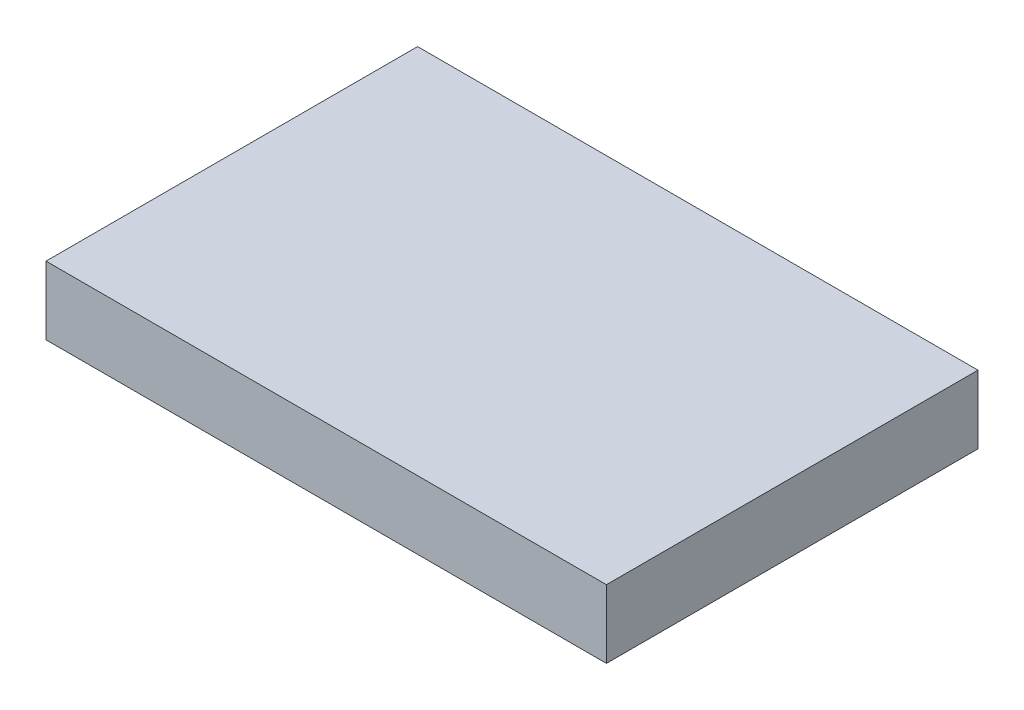
ISO-10303-21;
HEADER;
FILE_DESCRIPTION(('STEP AP214'),'2;1');
FILE_NAME('part.step','',(''),(''),'','','');
FILE_SCHEMA(('AUTOMOTIVE_DESIGN { 1 0 10303 214 1 1 1 1 }'));
ENDSEC;
DATA;
#1=APPLICATION_CONTEXT('core data for automotive mechanical design processes');
#2=APPLICATION_PROTOCOL_DEFINITION('international standard','automotive_design',2000,#1);
#3=PRODUCT_CONTEXT('',#1,'mechanical');
#4=PRODUCT('Part','Part','',(#3));
#5=PRODUCT_RELATED_PRODUCT_CATEGORY('part','',(#4));
#6=PRODUCT_DEFINITION_FORMATION('','',#4);
#7=PRODUCT_DEFINITION_CONTEXT('part definition',#1,'design');
#8=PRODUCT_DEFINITION('design','',#6,#7);
#9=PRODUCT_DEFINITION_SHAPE('','',#8);
#10=(LENGTH_UNIT() NAMED_UNIT(*) SI_UNIT(.MILLI.,.METRE.));
#11=(NAMED_UNIT(*) PLANE_ANGLE_UNIT() SI_UNIT($,.RADIAN.));
#12=(NAMED_UNIT(*) SI_UNIT($,.STERADIAN.) SOLID_ANGLE_UNIT());
#13=UNCERTAINTY_MEASURE_WITH_UNIT(LENGTH_MEASURE(1.E-05),#10,'distance_accuracy_value','');
#14=(GEOMETRIC_REPRESENTATION_CONTEXT(3) GLOBAL_UNCERTAINTY_ASSIGNED_CONTEXT((#13)) GLOBAL_UNIT_ASSIGNED_CONTEXT((#10,
#11,#12)) REPRESENTATION_CONTEXT('',''));
#15=CARTESIAN_POINT('',(0.,0.,0.));
#16=DIRECTION('',(0.,0.,1.));
#17=DIRECTION('',(1.,0.,0.));
#18=AXIS2_PLACEMENT_3D('',#15,#16,#17);
#19=CARTESIAN_POINT('',(-41.1,10.,-27.25));
#20=DIRECTION('',(1.,0.,0.));
#21=DIRECTION('',(0.,0.,-1.));
#22=AXIS2_PLACEMENT_3D('',#19,#20,#21);
#23=PLANE('',#22);
#24=DIRECTION('',(0.,0.,1.));
#25=VECTOR('',#24,1.);
#26=CARTESIAN_POINT('',(-41.1,0.,-27.25));
#27=LINE('',#26,#25);
#28=CARTESIAN_POINT('',(-41.1,0.,-27.25));
#29=VERTEX_POINT('',#28);
#30=CARTESIAN_POINT('',(-41.1,0.,27.25));
#31=VERTEX_POINT('',#30);
#32=EDGE_CURVE('E107',#29,#31,#27,.T.);
#33=ORIENTED_EDGE('',*,*,#32,.T.);
#34=DIRECTION('',(0.,-1.,0.));
#35=VECTOR('',#34,1.);
#36=CARTESIAN_POINT('',(-41.1,10.,27.25));
#37=LINE('',#36,#35);
#38=CARTESIAN_POINT('',(-41.1,10.,27.25));
#39=VERTEX_POINT('',#38);
#40=EDGE_CURVE('E11',#39,#31,#37,.T.);
#41=ORIENTED_EDGE('',*,*,#40,.F.);
#42=DIRECTION('',(0.,0.,1.));
#43=VECTOR('',#42,1.);
#44=CARTESIAN_POINT('',(-41.1,10.,-27.25));
#45=LINE('',#44,#43);
#46=CARTESIAN_POINT('',(-41.1,10.,-27.25));
#47=VERTEX_POINT('',#46);
#48=EDGE_CURVE('E91',#47,#39,#45,.T.);
#49=ORIENTED_EDGE('',*,*,#48,.F.);
#50=DIRECTION('',(0.,-1.,0.));
#51=VECTOR('',#50,1.);
#52=CARTESIAN_POINT('',(-41.1,10.,-27.25));
#53=LINE('',#52,#51);
#54=EDGE_CURVE('E103',#47,#29,#53,.T.);
#55=ORIENTED_EDGE('',*,*,#54,.T.);
#56=EDGE_LOOP('',(#33,#41,#49,#55));
#57=FACE_BOUND('',#56,.T.);
#58=ADVANCED_FACE('F39',(#57),#23,.F.);
#59=CARTESIAN_POINT('',(-41.1,10.,27.25));
#60=DIRECTION('',(0.,0.,-1.));
#61=DIRECTION('',(-1.,0.,0.));
#62=AXIS2_PLACEMENT_3D('',#59,#60,#61);
#63=PLANE('',#62);
#64=DIRECTION('',(1.,0.,0.));
#65=VECTOR('',#64,1.);
#66=CARTESIAN_POINT('',(-41.1,0.,27.25));
#67=LINE('',#66,#65);
#68=CARTESIAN_POINT('',(41.1,0.,27.25));
#69=VERTEX_POINT('',#68);
#70=EDGE_CURVE('E96',#31,#69,#67,.T.);
#71=ORIENTED_EDGE('',*,*,#70,.T.);
#72=DIRECTION('',(0.,-1.,0.));
#73=VECTOR('',#72,1.);
#74=CARTESIAN_POINT('',(41.1,10.,27.25));
#75=LINE('',#74,#73);
#76=CARTESIAN_POINT('',(41.1,10.,27.25));
#77=VERTEX_POINT('',#76);
#78=EDGE_CURVE('E48',#77,#69,#75,.T.);
#79=ORIENTED_EDGE('',*,*,#78,.F.);
#80=DIRECTION('',(1.,0.,0.));
#81=VECTOR('',#80,1.);
#82=CARTESIAN_POINT('',(-41.1,10.,27.25));
#83=LINE('',#82,#81);
#84=EDGE_CURVE('E86',#39,#77,#83,.T.);
#85=ORIENTED_EDGE('',*,*,#84,.F.);
#86=ORIENTED_EDGE('',*,*,#40,.T.);
#87=EDGE_LOOP('',(#71,#79,#85,#86));
#88=FACE_BOUND('',#87,.T.);
#89=ADVANCED_FACE('F95',(#88),#63,.F.);
#90=CARTESIAN_POINT('',(41.1,10.,-27.25));
#91=DIRECTION('',(-1.,0.,0.));
#92=DIRECTION('',(0.,0.,1.));
#93=AXIS2_PLACEMENT_3D('',#90,#91,#92);
#94=PLANE('',#93);
#95=DIRECTION('',(0.,0.,-1.));
#96=VECTOR('',#95,1.);
#97=CARTESIAN_POINT('',(41.1,0.,-27.25));
#98=LINE('',#97,#96);
#99=CARTESIAN_POINT('',(41.1,0.,-27.25));
#100=VERTEX_POINT('',#99);
#101=EDGE_CURVE('E73',#69,#100,#98,.T.);
#102=ORIENTED_EDGE('',*,*,#101,.T.);
#103=DIRECTION('',(0.,-1.,0.));
#104=VECTOR('',#103,1.);
#105=CARTESIAN_POINT('',(41.1,10.,-27.25));
#106=LINE('',#105,#104);
#107=CARTESIAN_POINT('',(41.1,10.,-27.25));
#108=VERTEX_POINT('',#107);
#109=EDGE_CURVE('E98',#108,#100,#106,.T.);
#110=ORIENTED_EDGE('',*,*,#109,.F.);
#111=DIRECTION('',(0.,0.,-1.));
#112=VECTOR('',#111,1.);
#113=CARTESIAN_POINT('',(41.1,10.,-27.25));
#114=LINE('',#113,#112);
#115=EDGE_CURVE('E89',#77,#108,#114,.T.);
#116=ORIENTED_EDGE('',*,*,#115,.F.);
#117=ORIENTED_EDGE('',*,*,#78,.T.);
#118=EDGE_LOOP('',(#102,#110,#116,#117));
#119=FACE_BOUND('',#118,.T.);
#120=ADVANCED_FACE('F99',(#119),#94,.F.);
#121=CARTESIAN_POINT('',(-41.1,10.,-27.25));
#122=DIRECTION('',(0.,0.,1.));
#123=DIRECTION('',(1.,0.,0.));
#124=AXIS2_PLACEMENT_3D('',#121,#122,#123);
#125=PLANE('',#124);
#126=DIRECTION('',(-1.,0.,0.));
#127=VECTOR('',#126,1.);
#128=CARTESIAN_POINT('',(-41.1,0.,-27.25));
#129=LINE('',#128,#127);
#130=EDGE_CURVE('E79',#100,#29,#129,.T.);
#131=ORIENTED_EDGE('',*,*,#130,.T.);
#132=ORIENTED_EDGE('',*,*,#54,.F.);
#133=DIRECTION('',(-1.,0.,0.));
#134=VECTOR('',#133,1.);
#135=CARTESIAN_POINT('',(-41.1,10.,-27.25));
#136=LINE('',#135,#134);
#137=EDGE_CURVE('E56',#108,#47,#136,.T.);
#138=ORIENTED_EDGE('',*,*,#137,.F.);
#139=ORIENTED_EDGE('',*,*,#109,.T.);
#140=EDGE_LOOP('',(#131,#132,#138,#139));
#141=FACE_BOUND('',#140,.T.);
#142=ADVANCED_FACE('F120',(#141),#125,.F.);
#143=CARTESIAN_POINT('',(0.,10.,0.));
#144=DIRECTION('',(0.,1.,0.));
#145=DIRECTION('',(0.,0.,1.));
#146=AXIS2_PLACEMENT_3D('',#143,#144,#145);
#147=PLANE('',#146);
#148=ORIENTED_EDGE('',*,*,#48,.T.);
#149=ORIENTED_EDGE('',*,*,#84,.T.);
#150=ORIENTED_EDGE('',*,*,#115,.T.);
#151=ORIENTED_EDGE('',*,*,#137,.T.);
#152=EDGE_LOOP('',(#148,#149,#150,#151));
#153=FACE_BOUND('',#152,.T.);
#154=ADVANCED_FACE('F87',(#153),#147,.T.);
#155=CARTESIAN_POINT('',(0.,0.,0.));
#156=DIRECTION('',(0.,1.,0.));
#157=DIRECTION('',(0.,0.,1.));
#158=AXIS2_PLACEMENT_3D('',#155,#156,#157);
#159=PLANE('',#158);
#160=ORIENTED_EDGE('',*,*,#32,.F.);
#161=ORIENTED_EDGE('',*,*,#130,.F.);
#162=ORIENTED_EDGE('',*,*,#101,.F.);
#163=ORIENTED_EDGE('',*,*,#70,.F.);
#164=EDGE_LOOP('',(#160,#161,#162,#163));
#165=FACE_BOUND('',#164,.T.);
#166=ADVANCED_FACE('F123',(#165),#159,.F.);
#167=CLOSED_SHELL('',(#58,#89,#120,#142,#154,#166));
#168=MANIFOLD_SOLID_BREP('B2',#167);
#169=ADVANCED_BREP_SHAPE_REPRESENTATION('',(#18,#168),#14);
#170=SHAPE_DEFINITION_REPRESENTATION(#9,#169);
ENDSEC;
END-ISO-10303-21;
